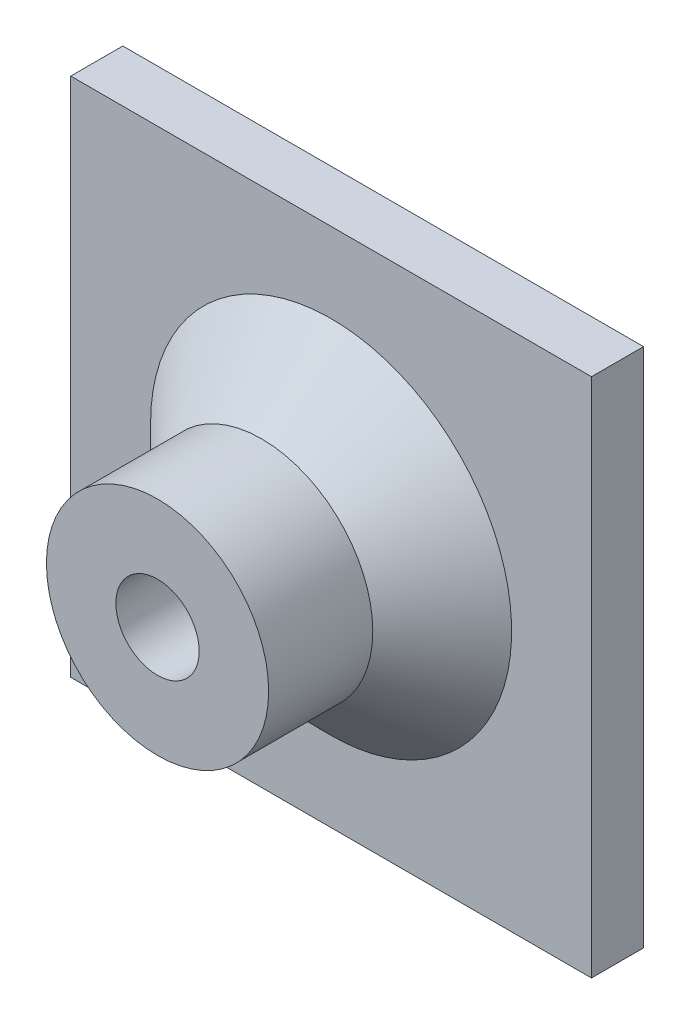
ISO-10303-21;
HEADER;
FILE_DESCRIPTION(('STEP AP214'),'2;1');
FILE_NAME('part.step','',(''),(''),'','','');
FILE_SCHEMA(('AUTOMOTIVE_DESIGN { 1 0 10303 214 1 1 1 1 }'));
ENDSEC;
DATA;
#1=APPLICATION_CONTEXT('core data for automotive mechanical design processes');
#2=APPLICATION_PROTOCOL_DEFINITION('international standard','automotive_design',2000,#1);
#3=PRODUCT_CONTEXT('',#1,'mechanical');
#4=PRODUCT('Part','Part','',(#3));
#5=PRODUCT_RELATED_PRODUCT_CATEGORY('part','',(#4));
#6=PRODUCT_DEFINITION_FORMATION('','',#4);
#7=PRODUCT_DEFINITION_CONTEXT('part definition',#1,'design');
#8=PRODUCT_DEFINITION('design','',#6,#7);
#9=PRODUCT_DEFINITION_SHAPE('','',#8);
#10=(LENGTH_UNIT() NAMED_UNIT(*) SI_UNIT(.MILLI.,.METRE.));
#11=(NAMED_UNIT(*) PLANE_ANGLE_UNIT() SI_UNIT($,.RADIAN.));
#12=(NAMED_UNIT(*) SI_UNIT($,.STERADIAN.) SOLID_ANGLE_UNIT());
#13=UNCERTAINTY_MEASURE_WITH_UNIT(LENGTH_MEASURE(1.E-05),#10,'distance_accuracy_value','');
#14=(GEOMETRIC_REPRESENTATION_CONTEXT(3) GLOBAL_UNCERTAINTY_ASSIGNED_CONTEXT((#13)) GLOBAL_UNIT_ASSIGNED_CONTEXT((#10,
#11,#12)) REPRESENTATION_CONTEXT('',''));
#15=CARTESIAN_POINT('',(0.,0.,0.));
#16=DIRECTION('',(0.,0.,1.));
#17=DIRECTION('',(1.,0.,0.));
#18=AXIS2_PLACEMENT_3D('',#15,#16,#17);
#19=CARTESIAN_POINT('',(0.,0.,1.5));
#20=DIRECTION('',(0.,0.,-1.));
#21=DIRECTION('',(-1.,0.,0.));
#22=AXIS2_PLACEMENT_3D('',#19,#20,#21);
#23=PLANE('',#22);
#24=CARTESIAN_POINT('',(0.,0.,1.5));
#25=DIRECTION('',(0.,0.,-1.));
#26=DIRECTION('',(-1.,0.,0.));
#27=AXIS2_PLACEMENT_3D('',#24,#25,#26);
#28=CIRCLE('',#27,5.19999999999999);
#29=CARTESIAN_POINT('',(-5.19999999999999,0.,1.5));
#30=VERTEX_POINT('',#29);
#31=EDGE_CURVE('E11',#30,#30,#28,.T.);
#32=ORIENTED_EDGE('',*,*,#31,.T.);
#33=EDGE_LOOP('',(#32));
#34=FACE_BOUND('',#33,.T.);
#35=DIRECTION('',(0.,1.,0.));
#36=VECTOR('',#35,1.);
#37=CARTESIAN_POINT('',(7.5,-7.5,1.5));
#38=LINE('',#37,#36);
#39=CARTESIAN_POINT('',(7.5,-7.5,1.5));
#40=VERTEX_POINT('',#39);
#41=CARTESIAN_POINT('',(7.5,7.5,1.5));
#42=VERTEX_POINT('',#41);
#43=EDGE_CURVE('E87',#40,#42,#38,.T.);
#44=ORIENTED_EDGE('',*,*,#43,.T.);
#45=DIRECTION('',(-1.,0.,0.));
#46=VECTOR('',#45,1.);
#47=CARTESIAN_POINT('',(-7.5,7.5,1.5));
#48=LINE('',#47,#46);
#49=CARTESIAN_POINT('',(-7.5,7.5,1.5));
#50=VERTEX_POINT('',#49);
#51=EDGE_CURVE('E83',#42,#50,#48,.T.);
#52=ORIENTED_EDGE('',*,*,#51,.T.);
#53=DIRECTION('',(0.,-1.,0.));
#54=VECTOR('',#53,1.);
#55=CARTESIAN_POINT('',(-7.5,-7.5,1.5));
#56=LINE('',#55,#54);
#57=CARTESIAN_POINT('',(-7.5,-7.5,1.5));
#58=VERTEX_POINT('',#57);
#59=EDGE_CURVE('E85',#50,#58,#56,.T.);
#60=ORIENTED_EDGE('',*,*,#59,.T.);
#61=DIRECTION('',(1.,0.,0.));
#62=VECTOR('',#61,1.);
#63=CARTESIAN_POINT('',(-7.5,-7.5,1.5));
#64=LINE('',#63,#62);
#65=EDGE_CURVE('E52',#58,#40,#64,.T.);
#66=ORIENTED_EDGE('',*,*,#65,.T.);
#67=EDGE_LOOP('',(#44,#52,#60,#66));
#68=FACE_BOUND('',#67,.T.);
#69=ADVANCED_FACE('F35',(#34,#68),#23,.F.);
#70=CARTESIAN_POINT('',(0.,0.,0.));
#71=DIRECTION('',(0.,0.,-1.));
#72=DIRECTION('',(-1.,0.,0.));
#73=AXIS2_PLACEMENT_3D('',#70,#71,#72);
#74=PLANE('',#73);
#75=CARTESIAN_POINT('',(0.,0.,0.));
#76=DIRECTION('',(0.,0.,-1.));
#77=DIRECTION('',(-1.,0.,0.));
#78=AXIS2_PLACEMENT_3D('',#75,#76,#77);
#79=CIRCLE('',#78,2.4);
#80=CARTESIAN_POINT('',(-2.39999999999999,0.,0.));
#81=VERTEX_POINT('',#80);
#82=EDGE_CURVE('E112',#81,#81,#79,.F.);
#83=ORIENTED_EDGE('',*,*,#82,.T.);
#84=EDGE_LOOP('',(#83));
#85=FACE_BOUND('',#84,.T.);
#86=DIRECTION('',(0.,1.,0.));
#87=VECTOR('',#86,1.);
#88=CARTESIAN_POINT('',(7.5,-7.5,0.));
#89=LINE('',#88,#87);
#90=CARTESIAN_POINT('',(7.5,-7.5,0.));
#91=VERTEX_POINT('',#90);
#92=CARTESIAN_POINT('',(7.5,7.5,0.));
#93=VERTEX_POINT('',#92);
#94=EDGE_CURVE('E102',#91,#93,#89,.T.);
#95=ORIENTED_EDGE('',*,*,#94,.F.);
#96=DIRECTION('',(1.,0.,0.));
#97=VECTOR('',#96,1.);
#98=CARTESIAN_POINT('',(-7.5,-7.5,0.));
#99=LINE('',#98,#97);
#100=CARTESIAN_POINT('',(-7.5,-7.5,0.));
#101=VERTEX_POINT('',#100);
#102=EDGE_CURVE('E75',#101,#91,#99,.T.);
#103=ORIENTED_EDGE('',*,*,#102,.F.);
#104=DIRECTION('',(0.,-1.,0.));
#105=VECTOR('',#104,1.);
#106=CARTESIAN_POINT('',(-7.5,-7.5,0.));
#107=LINE('',#106,#105);
#108=CARTESIAN_POINT('',(-7.5,7.5,0.));
#109=VERTEX_POINT('',#108);
#110=EDGE_CURVE('E69',#109,#101,#107,.T.);
#111=ORIENTED_EDGE('',*,*,#110,.F.);
#112=DIRECTION('',(-1.,0.,0.));
#113=VECTOR('',#112,1.);
#114=CARTESIAN_POINT('',(-7.5,7.5,0.));
#115=LINE('',#114,#113);
#116=EDGE_CURVE('E92',#93,#109,#115,.T.);
#117=ORIENTED_EDGE('',*,*,#116,.F.);
#118=EDGE_LOOP('',(#95,#103,#111,#117));
#119=FACE_BOUND('',#118,.T.);
#120=ADVANCED_FACE('F132',(#85,#119),#74,.T.);
#121=CARTESIAN_POINT('',(7.5,-7.5,1.5));
#122=DIRECTION('',(-1.,0.,0.));
#123=DIRECTION('',(0.,0.,1.));
#124=AXIS2_PLACEMENT_3D('',#121,#122,#123);
#125=PLANE('',#124);
#126=ORIENTED_EDGE('',*,*,#94,.T.);
#127=DIRECTION('',(0.,0.,-1.));
#128=VECTOR('',#127,1.);
#129=CARTESIAN_POINT('',(7.5,7.5,1.5));
#130=LINE('',#129,#128);
#131=EDGE_CURVE('E93',#42,#93,#130,.T.);
#132=ORIENTED_EDGE('',*,*,#131,.F.);
#133=ORIENTED_EDGE('',*,*,#43,.F.);
#134=DIRECTION('',(0.,0.,-1.));
#135=VECTOR('',#134,1.);
#136=CARTESIAN_POINT('',(7.5,-7.5,1.5));
#137=LINE('',#136,#135);
#138=EDGE_CURVE('E98',#40,#91,#137,.T.);
#139=ORIENTED_EDGE('',*,*,#138,.T.);
#140=EDGE_LOOP('',(#126,#132,#133,#139));
#141=FACE_BOUND('',#140,.T.);
#142=ADVANCED_FACE('F138',(#141),#125,.F.);
#143=CARTESIAN_POINT('',(-7.5,7.5,1.5));
#144=DIRECTION('',(0.,-1.,0.));
#145=DIRECTION('',(0.,0.,-1.));
#146=AXIS2_PLACEMENT_3D('',#143,#144,#145);
#147=PLANE('',#146);
#148=ORIENTED_EDGE('',*,*,#116,.T.);
#149=DIRECTION('',(0.,0.,-1.));
#150=VECTOR('',#149,1.);
#151=CARTESIAN_POINT('',(-7.5,7.5,1.5));
#152=LINE('',#151,#150);
#153=EDGE_CURVE('E90',#50,#109,#152,.T.);
#154=ORIENTED_EDGE('',*,*,#153,.F.);
#155=ORIENTED_EDGE('',*,*,#51,.F.);
#156=ORIENTED_EDGE('',*,*,#131,.T.);
#157=EDGE_LOOP('',(#148,#154,#155,#156));
#158=FACE_BOUND('',#157,.T.);
#159=ADVANCED_FACE('F91',(#158),#147,.F.);
#160=CARTESIAN_POINT('',(-7.5,-7.5,1.5));
#161=DIRECTION('',(1.,0.,0.));
#162=DIRECTION('',(0.,0.,-1.));
#163=AXIS2_PLACEMENT_3D('',#160,#161,#162);
#164=PLANE('',#163);
#165=ORIENTED_EDGE('',*,*,#110,.T.);
#166=DIRECTION('',(0.,0.,-1.));
#167=VECTOR('',#166,1.);
#168=CARTESIAN_POINT('',(-7.5,-7.5,1.5));
#169=LINE('',#168,#167);
#170=EDGE_CURVE('E94',#58,#101,#169,.T.);
#171=ORIENTED_EDGE('',*,*,#170,.F.);
#172=ORIENTED_EDGE('',*,*,#59,.F.);
#173=ORIENTED_EDGE('',*,*,#153,.T.);
#174=EDGE_LOOP('',(#165,#171,#172,#173));
#175=FACE_BOUND('',#174,.T.);
#176=ADVANCED_FACE('F96',(#175),#164,.F.);
#177=CARTESIAN_POINT('',(-7.5,-7.5,1.5));
#178=DIRECTION('',(0.,1.,0.));
#179=DIRECTION('',(0.,0.,1.));
#180=AXIS2_PLACEMENT_3D('',#177,#178,#179);
#181=PLANE('',#180);
#182=ORIENTED_EDGE('',*,*,#102,.T.);
#183=ORIENTED_EDGE('',*,*,#138,.F.);
#184=ORIENTED_EDGE('',*,*,#65,.F.);
#185=ORIENTED_EDGE('',*,*,#170,.T.);
#186=EDGE_LOOP('',(#182,#183,#184,#185));
#187=FACE_BOUND('',#186,.T.);
#188=ADVANCED_FACE('F145',(#187),#181,.F.);
#189=CARTESIAN_POINT('',(0.,0.,1.5));
#190=DIRECTION('',(0.,0.,-1.));
#191=DIRECTION('',(-1.,0.,0.));
#192=AXIS2_PLACEMENT_3D('',#189,#190,#191);
#193=CYLINDRICAL_SURFACE('',#192,1.2);
#194=CARTESIAN_POINT('',(0.,0.,1.2));
#195=DIRECTION('',(0.,0.,-1.));
#196=DIRECTION('',(-1.,0.,0.));
#197=AXIS2_PLACEMENT_3D('',#194,#195,#196);
#198=CIRCLE('',#197,1.2);
#199=CARTESIAN_POINT('',(-1.2,0.,1.2));
#200=VERTEX_POINT('',#199);
#201=EDGE_CURVE('E115',#200,#200,#198,.T.);
#202=ORIENTED_EDGE('',*,*,#201,.T.);
#203=EDGE_LOOP('',(#202));
#204=FACE_BOUND('',#203,.T.);
#205=CARTESIAN_POINT('',(0.,0.,6.5));
#206=DIRECTION('',(0.,0.,1.));
#207=DIRECTION('',(1.,0.,0.));
#208=AXIS2_PLACEMENT_3D('',#205,#206,#207);
#209=CIRCLE('',#208,1.2);
#210=CARTESIAN_POINT('',(1.2,0.,6.5));
#211=VERTEX_POINT('',#210);
#212=EDGE_CURVE('E161',#211,#211,#209,.T.);
#213=ORIENTED_EDGE('',*,*,#212,.T.);
#214=EDGE_LOOP('',(#213));
#215=FACE_BOUND('',#214,.T.);
#216=ADVANCED_FACE('F142',(#204,#215),#193,.F.);
#217=CARTESIAN_POINT('',(0.,0.,6.5));
#218=DIRECTION('',(0.,0.,1.));
#219=DIRECTION('',(1.,0.,0.));
#220=AXIS2_PLACEMENT_3D('',#217,#218,#219);
#221=PLANE('',#220);
#222=CARTESIAN_POINT('',(0.,0.,6.5));
#223=DIRECTION('',(0.,0.,1.));
#224=DIRECTION('',(1.,0.,0.));
#225=AXIS2_PLACEMENT_3D('',#222,#223,#224);
#226=CIRCLE('',#225,3.2);
#227=CARTESIAN_POINT('',(3.2,0.,6.5));
#228=VERTEX_POINT('',#227);
#229=EDGE_CURVE('E105',#228,#228,#226,.T.);
#230=ORIENTED_EDGE('',*,*,#229,.T.);
#231=EDGE_LOOP('',(#230));
#232=FACE_BOUND('',#231,.T.);
#233=ORIENTED_EDGE('',*,*,#212,.F.);
#234=EDGE_LOOP('',(#233));
#235=FACE_BOUND('',#234,.T.);
#236=ADVANCED_FACE('F166',(#232,#235),#221,.T.);
#237=CARTESIAN_POINT('',(0.,0.,6.5));
#238=DIRECTION('',(0.,0.,-1.));
#239=DIRECTION('',(-1.,0.,0.));
#240=AXIS2_PLACEMENT_3D('',#237,#238,#239);
#241=CYLINDRICAL_SURFACE('',#240,3.2);
#242=CARTESIAN_POINT('',(0.,0.,3.50000000000001));
#243=DIRECTION('',(0.,0.,-1.));
#244=DIRECTION('',(-1.,0.,0.));
#245=AXIS2_PLACEMENT_3D('',#242,#243,#244);
#246=CIRCLE('',#245,3.2);
#247=CARTESIAN_POINT('',(-3.2,0.,3.50000000000001));
#248=VERTEX_POINT('',#247);
#249=EDGE_CURVE('E44',#248,#248,#246,.F.);
#250=ORIENTED_EDGE('',*,*,#249,.T.);
#251=EDGE_LOOP('',(#250));
#252=FACE_BOUND('',#251,.T.);
#253=ORIENTED_EDGE('',*,*,#229,.F.);
#254=EDGE_LOOP('',(#253));
#255=FACE_BOUND('',#254,.T.);
#256=ADVANCED_FACE('F120',(#252,#255),#241,.T.);
#257=CARTESIAN_POINT('',(0.,0.,0.));
#258=DIRECTION('',(0.,0.,-1.));
#259=DIRECTION('',(-1.,0.,0.));
#260=AXIS2_PLACEMENT_3D('',#257,#258,#259);
#261=CONICAL_SURFACE('',#260,2.4,0.785398163397446);
#262=ORIENTED_EDGE('',*,*,#201,.F.);
#263=EDGE_LOOP('',(#262));
#264=FACE_BOUND('',#263,.T.);
#265=ORIENTED_EDGE('',*,*,#82,.F.);
#266=EDGE_LOOP('',(#265));
#267=FACE_BOUND('',#266,.T.);
#268=ADVANCED_FACE('F124',(#264,#267),#261,.F.);
#269=CARTESIAN_POINT('',(0.,0.,3.50000000000001));
#270=DIRECTION('',(0.,0.,-1.));
#271=DIRECTION('',(-1.,0.,0.));
#272=AXIS2_PLACEMENT_3D('',#269,#270,#271);
#273=CONICAL_SURFACE('',#272,3.2,0.785398163397444);
#274=ORIENTED_EDGE('',*,*,#31,.F.);
#275=EDGE_LOOP('',(#274));
#276=FACE_BOUND('',#275,.T.);
#277=ORIENTED_EDGE('',*,*,#249,.F.);
#278=EDGE_LOOP('',(#277));
#279=FACE_BOUND('',#278,.T.);
#280=ADVANCED_FACE('F37',(#276,#279),#273,.T.);
#281=CLOSED_SHELL('',(#69,#120,#142,#159,#176,#188,#216,#236,#256,#268,#280));
#282=MANIFOLD_SOLID_BREP('B2',#281);
#283=ADVANCED_BREP_SHAPE_REPRESENTATION('',(#18,#282),#14);
#284=SHAPE_DEFINITION_REPRESENTATION(#9,#283);
ENDSEC;
END-ISO-10303-21;
